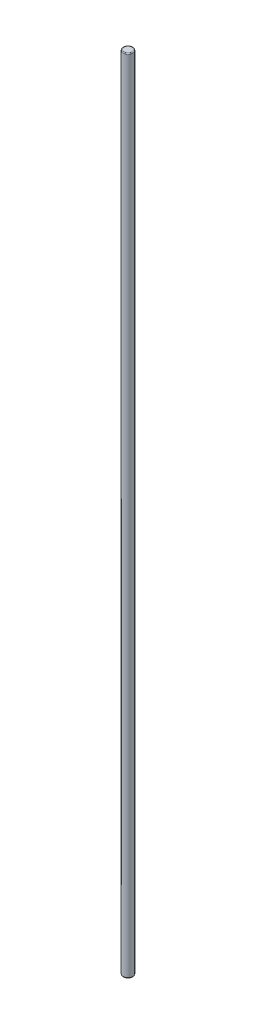
ISO-10303-21;
HEADER;
FILE_DESCRIPTION(('STEP AP214'),'2;1');
FILE_NAME('part.step','',(''),(''),'','','');
FILE_SCHEMA(('AUTOMOTIVE_DESIGN { 1 0 10303 214 1 1 1 1 }'));
ENDSEC;
DATA;
#1=APPLICATION_CONTEXT('core data for automotive mechanical design processes');
#2=APPLICATION_PROTOCOL_DEFINITION('international standard','automotive_design',2000,#1);
#3=PRODUCT_CONTEXT('',#1,'mechanical');
#4=PRODUCT('Part','Part','',(#3));
#5=PRODUCT_RELATED_PRODUCT_CATEGORY('part','',(#4));
#6=PRODUCT_DEFINITION_FORMATION('','',#4);
#7=PRODUCT_DEFINITION_CONTEXT('part definition',#1,'design');
#8=PRODUCT_DEFINITION('design','',#6,#7);
#9=PRODUCT_DEFINITION_SHAPE('','',#8);
#10=(LENGTH_UNIT() NAMED_UNIT(*) SI_UNIT(.MILLI.,.METRE.));
#11=(NAMED_UNIT(*) PLANE_ANGLE_UNIT() SI_UNIT($,.RADIAN.));
#12=(NAMED_UNIT(*) SI_UNIT($,.STERADIAN.) SOLID_ANGLE_UNIT());
#13=UNCERTAINTY_MEASURE_WITH_UNIT(LENGTH_MEASURE(1.E-05),#10,'distance_accuracy_value','');
#14=(GEOMETRIC_REPRESENTATION_CONTEXT(3) GLOBAL_UNCERTAINTY_ASSIGNED_CONTEXT((#13)) GLOBAL_UNIT_ASSIGNED_CONTEXT((#10,
#11,#12)) REPRESENTATION_CONTEXT('',''));
#15=CARTESIAN_POINT('',(0.,0.,0.));
#16=DIRECTION('',(0.,0.,1.));
#17=DIRECTION('',(1.,0.,0.));
#18=AXIS2_PLACEMENT_3D('',#15,#16,#17);
#19=CARTESIAN_POINT('',(0.,1000.,0.));
#20=DIRECTION('',(0.,-1.,0.));
#21=DIRECTION('',(0.,0.,-1.));
#22=AXIS2_PLACEMENT_3D('',#19,#20,#21);
#23=CYLINDRICAL_SURFACE('',#22,6.);
#24=CARTESIAN_POINT('',(0.,1.,0.));
#25=DIRECTION('',(0.,1.,0.));
#26=DIRECTION('',(0.,0.,1.));
#27=AXIS2_PLACEMENT_3D('',#24,#25,#26);
#28=CIRCLE('',#27,6.);
#29=CARTESIAN_POINT('',(0.,1.,6.));
#30=VERTEX_POINT('',#29);
#31=EDGE_CURVE('E48',#30,#30,#28,.T.);
#32=ORIENTED_EDGE('',*,*,#31,.T.);
#33=EDGE_LOOP('',(#32));
#34=FACE_BOUND('',#33,.T.);
#35=CARTESIAN_POINT('',(0.,999.,0.));
#36=DIRECTION('',(0.,1.,0.));
#37=DIRECTION('',(0.,0.,1.));
#38=AXIS2_PLACEMENT_3D('',#35,#36,#37);
#39=CIRCLE('',#38,6.);
#40=CARTESIAN_POINT('',(0.,999.,6.));
#41=VERTEX_POINT('',#40);
#42=EDGE_CURVE('E52',#41,#41,#39,.F.);
#43=ORIENTED_EDGE('',*,*,#42,.T.);
#44=EDGE_LOOP('',(#43));
#45=FACE_BOUND('',#44,.T.);
#46=ADVANCED_FACE('F37',(#34,#45),#23,.T.);
#47=CARTESIAN_POINT('',(0.,1000.,0.));
#48=DIRECTION('',(0.,1.,0.));
#49=DIRECTION('',(0.,0.,1.));
#50=AXIS2_PLACEMENT_3D('',#47,#48,#49);
#51=PLANE('',#50);
#52=CARTESIAN_POINT('',(0.,1000.,0.));
#53=DIRECTION('',(0.,1.,0.));
#54=DIRECTION('',(0.,0.,1.));
#55=AXIS2_PLACEMENT_3D('',#52,#53,#54);
#56=CIRCLE('',#55,5.);
#57=CARTESIAN_POINT('',(0.,1000.,5.));
#58=VERTEX_POINT('',#57);
#59=EDGE_CURVE('E10',#58,#58,#56,.T.);
#60=ORIENTED_EDGE('',*,*,#59,.T.);
#61=EDGE_LOOP('',(#60));
#62=FACE_BOUND('',#61,.T.);
#63=ADVANCED_FACE('F68',(#62),#51,.T.);
#64=CARTESIAN_POINT('',(0.,0.,0.));
#65=DIRECTION('',(0.,1.,0.));
#66=DIRECTION('',(0.,0.,1.));
#67=AXIS2_PLACEMENT_3D('',#64,#65,#66);
#68=PLANE('',#67);
#69=CARTESIAN_POINT('',(0.,0.,0.));
#70=DIRECTION('',(0.,1.,0.));
#71=DIRECTION('',(0.,0.,1.));
#72=AXIS2_PLACEMENT_3D('',#69,#70,#71);
#73=CIRCLE('',#72,5.);
#74=CARTESIAN_POINT('',(0.,0.,5.));
#75=VERTEX_POINT('',#74);
#76=EDGE_CURVE('E44',#75,#75,#73,.F.);
#77=ORIENTED_EDGE('',*,*,#76,.T.);
#78=EDGE_LOOP('',(#77));
#79=FACE_BOUND('',#78,.T.);
#80=ADVANCED_FACE('F65',(#79),#68,.F.);
#81=CARTESIAN_POINT('',(0.,1.,0.));
#82=DIRECTION('',(0.,1.,0.));
#83=DIRECTION('',(0.,0.,1.));
#84=AXIS2_PLACEMENT_3D('',#81,#82,#83);
#85=TOROIDAL_SURFACE('',#84,5.,1.);
#86=ORIENTED_EDGE('',*,*,#76,.F.);
#87=EDGE_LOOP('',(#86));
#88=FACE_BOUND('',#87,.T.);
#89=ORIENTED_EDGE('',*,*,#31,.F.);
#90=EDGE_LOOP('',(#89));
#91=FACE_BOUND('',#90,.T.);
#92=ADVANCED_FACE('F61',(#88,#91),#85,.T.);
#93=CARTESIAN_POINT('',(0.,999.,0.));
#94=DIRECTION('',(0.,1.,0.));
#95=DIRECTION('',(0.,0.,1.));
#96=AXIS2_PLACEMENT_3D('',#93,#94,#95);
#97=TOROIDAL_SURFACE('',#96,5.,1.);
#98=ORIENTED_EDGE('',*,*,#42,.F.);
#99=EDGE_LOOP('',(#98));
#100=FACE_BOUND('',#99,.T.);
#101=ORIENTED_EDGE('',*,*,#59,.F.);
#102=EDGE_LOOP('',(#101));
#103=FACE_BOUND('',#102,.T.);
#104=ADVANCED_FACE('F39',(#100,#103),#97,.T.);
#105=CLOSED_SHELL('',(#46,#63,#80,#92,#104));
#106=MANIFOLD_SOLID_BREP('B2',#105);
#107=ADVANCED_BREP_SHAPE_REPRESENTATION('',(#18,#106),#14);
#108=SHAPE_DEFINITION_REPRESENTATION(#9,#107);
ENDSEC;
END-ISO-10303-21;
